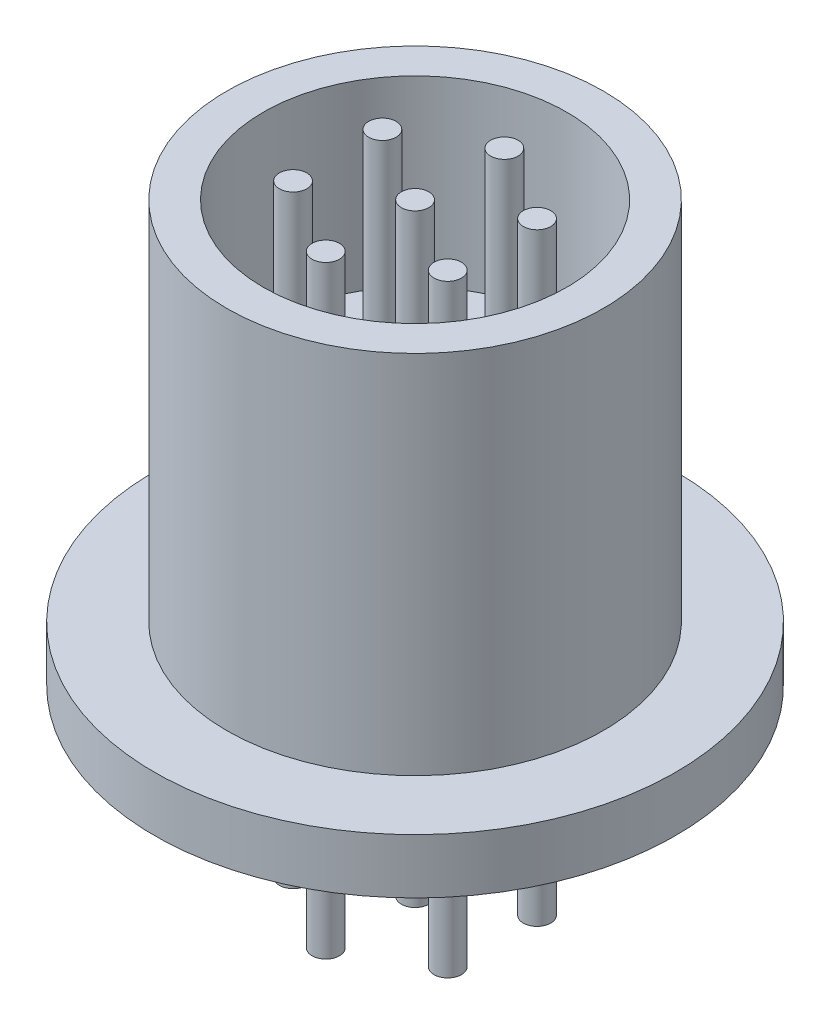
ISO-10303-21;
HEADER;
FILE_DESCRIPTION(('STEP AP214'),'2;1');
FILE_NAME('part.step','',(''),(''),'','','');
FILE_SCHEMA(('AUTOMOTIVE_DESIGN { 1 0 10303 214 1 1 1 1 }'));
ENDSEC;
DATA;
#1=APPLICATION_CONTEXT('core data for automotive mechanical design processes');
#2=APPLICATION_PROTOCOL_DEFINITION('international standard','automotive_design',2000,#1);
#3=PRODUCT_CONTEXT('',#1,'mechanical');
#4=PRODUCT('Part','Part','',(#3));
#5=PRODUCT_RELATED_PRODUCT_CATEGORY('part','',(#4));
#6=PRODUCT_DEFINITION_FORMATION('','',#4);
#7=PRODUCT_DEFINITION_CONTEXT('part definition',#1,'design');
#8=PRODUCT_DEFINITION('design','',#6,#7);
#9=PRODUCT_DEFINITION_SHAPE('','',#8);
#10=(LENGTH_UNIT() NAMED_UNIT(*) SI_UNIT(.MILLI.,.METRE.));
#11=(NAMED_UNIT(*) PLANE_ANGLE_UNIT() SI_UNIT($,.RADIAN.));
#12=(NAMED_UNIT(*) SI_UNIT($,.STERADIAN.) SOLID_ANGLE_UNIT());
#13=UNCERTAINTY_MEASURE_WITH_UNIT(LENGTH_MEASURE(1.E-05),#10,'distance_accuracy_value','');
#14=(GEOMETRIC_REPRESENTATION_CONTEXT(3) GLOBAL_UNCERTAINTY_ASSIGNED_CONTEXT((#13)) GLOBAL_UNIT_ASSIGNED_CONTEXT((#10,
#11,#12)) REPRESENTATION_CONTEXT('',''));
#15=CARTESIAN_POINT('',(0.,0.,0.));
#16=DIRECTION('',(0.,0.,1.));
#17=DIRECTION('',(1.,0.,0.));
#18=AXIS2_PLACEMENT_3D('',#15,#16,#17);
#19=CARTESIAN_POINT('',(0.,20.,0.));
#20=DIRECTION('',(0.,-1.,0.));
#21=DIRECTION('',(0.,0.,-1.));
#22=AXIS2_PLACEMENT_3D('',#19,#20,#21);
#23=CYLINDRICAL_SURFACE('',#22,10.3);
#24=CARTESIAN_POINT('',(0.,20.,0.));
#25=DIRECTION('',(0.,1.,0.));
#26=DIRECTION('',(0.,0.,1.));
#27=AXIS2_PLACEMENT_3D('',#24,#25,#26);
#28=CIRCLE('',#27,10.3);
#29=CARTESIAN_POINT('',(0.,20.,10.3));
#30=VERTEX_POINT('',#29);
#31=EDGE_CURVE('E10',#30,#30,#28,.T.);
#32=ORIENTED_EDGE('',*,*,#31,.F.);
#33=EDGE_LOOP('',(#32));
#34=FACE_BOUND('',#33,.T.);
#35=CARTESIAN_POINT('',(0.,0.,0.));
#36=DIRECTION('',(0.,-1.,0.));
#37=DIRECTION('',(0.,0.,-1.));
#38=AXIS2_PLACEMENT_3D('',#35,#36,#37);
#39=CIRCLE('',#38,10.3);
#40=CARTESIAN_POINT('',(0.,0.,-10.3));
#41=VERTEX_POINT('',#40);
#42=EDGE_CURVE('E39',#41,#41,#39,.T.);
#43=ORIENTED_EDGE('',*,*,#42,.F.);
#44=EDGE_LOOP('',(#43));
#45=FACE_BOUND('',#44,.T.);
#46=ADVANCED_FACE('F33',(#34,#45),#23,.T.);
#47=CARTESIAN_POINT('',(0.,20.,0.));
#48=DIRECTION('',(0.,1.,0.));
#49=DIRECTION('',(0.,0.,1.));
#50=AXIS2_PLACEMENT_3D('',#47,#48,#49);
#51=PLANE('',#50);
#52=CARTESIAN_POINT('',(0.,20.,0.));
#53=DIRECTION('',(0.,1.,0.));
#54=DIRECTION('',(0.,0.,1.));
#55=AXIS2_PLACEMENT_3D('',#52,#53,#54);
#56=CIRCLE('',#55,8.3);
#57=CARTESIAN_POINT('',(0.,20.,8.3));
#58=VERTEX_POINT('',#57);
#59=EDGE_CURVE('E53',#58,#58,#56,.T.);
#60=ORIENTED_EDGE('',*,*,#59,.F.);
#61=EDGE_LOOP('',(#60));
#62=FACE_BOUND('',#61,.T.);
#63=ORIENTED_EDGE('',*,*,#31,.T.);
#64=EDGE_LOOP('',(#63));
#65=FACE_BOUND('',#64,.T.);
#66=ADVANCED_FACE('F174',(#62,#65),#51,.T.);
#67=CARTESIAN_POINT('',(0.,-3.,0.));
#68=DIRECTION('',(0.,1.,0.));
#69=DIRECTION('',(0.,0.,1.));
#70=AXIS2_PLACEMENT_3D('',#67,#68,#69);
#71=CYLINDRICAL_SURFACE('',#70,14.25);
#72=CARTESIAN_POINT('',(0.,-3.,0.));
#73=DIRECTION('',(0.,-1.,0.));
#74=DIRECTION('',(0.,0.,-1.));
#75=AXIS2_PLACEMENT_3D('',#72,#73,#74);
#76=CIRCLE('',#75,14.25);
#77=CARTESIAN_POINT('',(0.,-3.,-14.25));
#78=VERTEX_POINT('',#77);
#79=EDGE_CURVE('E43',#78,#78,#76,.T.);
#80=ORIENTED_EDGE('',*,*,#79,.F.);
#81=EDGE_LOOP('',(#80));
#82=FACE_BOUND('',#81,.T.);
#83=CARTESIAN_POINT('',(0.,0.,0.));
#84=DIRECTION('',(0.,-1.,0.));
#85=DIRECTION('',(0.,0.,-1.));
#86=AXIS2_PLACEMENT_3D('',#83,#84,#85);
#87=CIRCLE('',#86,14.25);
#88=CARTESIAN_POINT('',(0.,0.,-14.25));
#89=VERTEX_POINT('',#88);
#90=EDGE_CURVE('E47',#89,#89,#87,.T.);
#91=ORIENTED_EDGE('',*,*,#90,.T.);
#92=EDGE_LOOP('',(#91));
#93=FACE_BOUND('',#92,.T.);
#94=ADVANCED_FACE('F156',(#82,#93),#71,.T.);
#95=CARTESIAN_POINT('',(0.,-3.,0.));
#96=DIRECTION('',(0.,-1.,0.));
#97=DIRECTION('',(0.,0.,-1.));
#98=AXIS2_PLACEMENT_3D('',#95,#96,#97);
#99=PLANE('',#98);
#100=CARTESIAN_POINT('',(0.,-3.,-4.88438553198296));
#101=DIRECTION('',(0.,-1.,0.));
#102=DIRECTION('',(0.,0.,-1.));
#103=AXIS2_PLACEMENT_3D('',#100,#101,#102);
#104=CIRCLE('',#103,0.75);
#105=CARTESIAN_POINT('',(0.,-3.,-5.63438553198296));
#106=VERTEX_POINT('',#105);
#107=EDGE_CURVE('E137',#106,#106,#104,.T.);
#108=ORIENTED_EDGE('',*,*,#107,.F.);
#109=EDGE_LOOP('',(#108));
#110=FACE_BOUND('',#109,.T.);
#111=CARTESIAN_POINT('',(4.23000195257455,-3.,-2.44219276599172));
#112=DIRECTION('',(0.,-1.,0.));
#113=DIRECTION('',(0.,0.,-1.));
#114=AXIS2_PLACEMENT_3D('',#111,#112,#113);
#115=CIRCLE('',#114,0.75);
#116=CARTESIAN_POINT('',(4.23000195257455,-3.,-3.19219276599172));
#117=VERTEX_POINT('',#116);
#118=EDGE_CURVE('E131',#117,#117,#115,.T.);
#119=ORIENTED_EDGE('',*,*,#118,.F.);
#120=EDGE_LOOP('',(#119));
#121=FACE_BOUND('',#120,.T.);
#122=CARTESIAN_POINT('',(4.23000195257483,-3.,2.44219276599124));
#123=DIRECTION('',(0.,-1.,0.));
#124=DIRECTION('',(0.,0.,-1.));
#125=AXIS2_PLACEMENT_3D('',#122,#123,#124);
#126=CIRCLE('',#125,0.749999999999999);
#127=CARTESIAN_POINT('',(4.23000195257483,-3.,1.69219276599124));
#128=VERTEX_POINT('',#127);
#129=EDGE_CURVE('E125',#128,#128,#126,.T.);
#130=ORIENTED_EDGE('',*,*,#129,.F.);
#131=EDGE_LOOP('',(#130));
#132=FACE_BOUND('',#131,.T.);
#133=CARTESIAN_POINT('',(5.54094015922848E-13,-3.,4.88438553198296));
#134=DIRECTION('',(0.,-1.,0.));
#135=DIRECTION('',(0.,0.,-1.));
#136=AXIS2_PLACEMENT_3D('',#133,#134,#135);
#137=CIRCLE('',#136,0.75);
#138=CARTESIAN_POINT('',(5.54094015922848E-13,-3.,4.13438553198296));
#139=VERTEX_POINT('',#138);
#140=EDGE_CURVE('E119',#139,#139,#137,.T.);
#141=ORIENTED_EDGE('',*,*,#140,.F.);
#142=EDGE_LOOP('',(#141));
#143=FACE_BOUND('',#142,.T.);
#144=CARTESIAN_POINT('',(-4.230001952574,-3.,2.44219276599172));
#145=DIRECTION('',(0.,-1.,0.));
#146=DIRECTION('',(0.,0.,-1.));
#147=AXIS2_PLACEMENT_3D('',#144,#145,#146);
#148=CIRCLE('',#147,0.75);
#149=CARTESIAN_POINT('',(-4.230001952574,-3.,1.69219276599172));
#150=VERTEX_POINT('',#149);
#151=EDGE_CURVE('E113',#150,#150,#148,.T.);
#152=ORIENTED_EDGE('',*,*,#151,.F.);
#153=EDGE_LOOP('',(#152));
#154=FACE_BOUND('',#153,.T.);
#155=CARTESIAN_POINT('',(-4.23000195257428,-3.,-2.44219276599124));
#156=DIRECTION('',(0.,-1.,0.));
#157=DIRECTION('',(0.,0.,-1.));
#158=AXIS2_PLACEMENT_3D('',#155,#156,#157);
#159=CIRCLE('',#158,0.75);
#160=CARTESIAN_POINT('',(-4.23000195257428,-3.,-3.19219276599124));
#161=VERTEX_POINT('',#160);
#162=EDGE_CURVE('E107',#161,#161,#159,.T.);
#163=ORIENTED_EDGE('',*,*,#162,.F.);
#164=EDGE_LOOP('',(#163));
#165=FACE_BOUND('',#164,.T.);
#166=CARTESIAN_POINT('',(0.,-3.,0.));
#167=DIRECTION('',(0.,-1.,0.));
#168=DIRECTION('',(0.,0.,-1.));
#169=AXIS2_PLACEMENT_3D('',#166,#167,#168);
#170=CIRCLE('',#169,0.75);
#171=CARTESIAN_POINT('',(0.,-3.,-0.75));
#172=VERTEX_POINT('',#171);
#173=EDGE_CURVE('E101',#172,#172,#170,.T.);
#174=ORIENTED_EDGE('',*,*,#173,.F.);
#175=EDGE_LOOP('',(#174));
#176=FACE_BOUND('',#175,.T.);
#177=ORIENTED_EDGE('',*,*,#79,.T.);
#178=EDGE_LOOP('',(#177));
#179=FACE_BOUND('',#178,.T.);
#180=ADVANCED_FACE('F152',(#110,#121,#132,#143,#154,#165,#176,#179),#99,.T.);
#181=CARTESIAN_POINT('',(0.,0.,0.));
#182=DIRECTION('',(0.,-1.,0.));
#183=DIRECTION('',(0.,0.,-1.));
#184=AXIS2_PLACEMENT_3D('',#181,#182,#183);
#185=PLANE('',#184);
#186=ORIENTED_EDGE('',*,*,#42,.T.);
#187=EDGE_LOOP('',(#186));
#188=FACE_BOUND('',#187,.T.);
#189=ORIENTED_EDGE('',*,*,#90,.F.);
#190=EDGE_LOOP('',(#189));
#191=FACE_BOUND('',#190,.T.);
#192=ADVANCED_FACE('F155',(#188,#191),#185,.F.);
#193=CARTESIAN_POINT('',(0.,10.,0.));
#194=DIRECTION('',(0.,1.,0.));
#195=DIRECTION('',(0.,0.,1.));
#196=AXIS2_PLACEMENT_3D('',#193,#194,#195);
#197=CYLINDRICAL_SURFACE('',#196,8.3);
#198=CARTESIAN_POINT('',(0.,10.,0.));
#199=DIRECTION('',(0.,1.,0.));
#200=DIRECTION('',(0.,0.,1.));
#201=AXIS2_PLACEMENT_3D('',#198,#199,#200);
#202=CIRCLE('',#201,8.3);
#203=CARTESIAN_POINT('',(0.,10.,8.3));
#204=VERTEX_POINT('',#203);
#205=EDGE_CURVE('E51',#204,#204,#202,.T.);
#206=ORIENTED_EDGE('',*,*,#205,.F.);
#207=EDGE_LOOP('',(#206));
#208=FACE_BOUND('',#207,.T.);
#209=ORIENTED_EDGE('',*,*,#59,.T.);
#210=EDGE_LOOP('',(#209));
#211=FACE_BOUND('',#210,.T.);
#212=ADVANCED_FACE('F179',(#208,#211),#197,.F.);
#213=CARTESIAN_POINT('',(0.,10.,0.));
#214=DIRECTION('',(0.,1.,0.));
#215=DIRECTION('',(0.,0.,1.));
#216=AXIS2_PLACEMENT_3D('',#213,#214,#215);
#217=PLANE('',#216);
#218=CARTESIAN_POINT('',(-4.23000195257428,10.,-2.44219276599124));
#219=DIRECTION('',(0.,1.,0.));
#220=DIRECTION('',(0.,0.,1.));
#221=AXIS2_PLACEMENT_3D('',#218,#219,#220);
#222=CIRCLE('',#221,0.75);
#223=CARTESIAN_POINT('',(-4.23000195257428,10.,-1.69219276599124));
#224=VERTEX_POINT('',#223);
#225=EDGE_CURVE('E95',#224,#224,#222,.T.);
#226=ORIENTED_EDGE('',*,*,#225,.F.);
#227=EDGE_LOOP('',(#226));
#228=FACE_BOUND('',#227,.T.);
#229=CARTESIAN_POINT('',(-4.230001952574,10.,2.44219276599172));
#230=DIRECTION('',(0.,1.,0.));
#231=DIRECTION('',(0.,0.,1.));
#232=AXIS2_PLACEMENT_3D('',#229,#230,#231);
#233=CIRCLE('',#232,0.75);
#234=CARTESIAN_POINT('',(-4.230001952574,10.,3.19219276599172));
#235=VERTEX_POINT('',#234);
#236=EDGE_CURVE('E89',#235,#235,#233,.T.);
#237=ORIENTED_EDGE('',*,*,#236,.F.);
#238=EDGE_LOOP('',(#237));
#239=FACE_BOUND('',#238,.T.);
#240=CARTESIAN_POINT('',(5.54094015922848E-13,10.,4.88438553198296));
#241=DIRECTION('',(0.,1.,0.));
#242=DIRECTION('',(0.,0.,1.));
#243=AXIS2_PLACEMENT_3D('',#240,#241,#242);
#244=CIRCLE('',#243,0.75);
#245=CARTESIAN_POINT('',(5.54094015922848E-13,10.,5.63438553198296));
#246=VERTEX_POINT('',#245);
#247=EDGE_CURVE('E83',#246,#246,#244,.T.);
#248=ORIENTED_EDGE('',*,*,#247,.F.);
#249=EDGE_LOOP('',(#248));
#250=FACE_BOUND('',#249,.T.);
#251=CARTESIAN_POINT('',(4.23000195257483,10.,2.44219276599124));
#252=DIRECTION('',(0.,1.,0.));
#253=DIRECTION('',(0.,0.,1.));
#254=AXIS2_PLACEMENT_3D('',#251,#252,#253);
#255=CIRCLE('',#254,0.749999999999999);
#256=CARTESIAN_POINT('',(4.23000195257483,10.,3.19219276599124));
#257=VERTEX_POINT('',#256);
#258=EDGE_CURVE('E77',#257,#257,#255,.T.);
#259=ORIENTED_EDGE('',*,*,#258,.F.);
#260=EDGE_LOOP('',(#259));
#261=FACE_BOUND('',#260,.T.);
#262=CARTESIAN_POINT('',(4.23000195257455,10.,-2.44219276599172));
#263=DIRECTION('',(0.,1.,0.));
#264=DIRECTION('',(0.,0.,1.));
#265=AXIS2_PLACEMENT_3D('',#262,#263,#264);
#266=CIRCLE('',#265,0.75);
#267=CARTESIAN_POINT('',(4.23000195257455,10.,-1.69219276599172));
#268=VERTEX_POINT('',#267);
#269=EDGE_CURVE('E71',#268,#268,#266,.T.);
#270=ORIENTED_EDGE('',*,*,#269,.F.);
#271=EDGE_LOOP('',(#270));
#272=FACE_BOUND('',#271,.T.);
#273=CARTESIAN_POINT('',(0.,10.,0.));
#274=DIRECTION('',(0.,1.,0.));
#275=DIRECTION('',(0.,0.,1.));
#276=AXIS2_PLACEMENT_3D('',#273,#274,#275);
#277=CIRCLE('',#276,0.75);
#278=CARTESIAN_POINT('',(0.,10.,0.75));
#279=VERTEX_POINT('',#278);
#280=EDGE_CURVE('E65',#279,#279,#277,.T.);
#281=ORIENTED_EDGE('',*,*,#280,.F.);
#282=EDGE_LOOP('',(#281));
#283=FACE_BOUND('',#282,.T.);
#284=CARTESIAN_POINT('',(0.,10.,-4.88438553198296));
#285=DIRECTION('',(0.,1.,0.));
#286=DIRECTION('',(0.,0.,1.));
#287=AXIS2_PLACEMENT_3D('',#284,#285,#286);
#288=CIRCLE('',#287,0.75);
#289=CARTESIAN_POINT('',(0.,10.,-4.13438553198296));
#290=VERTEX_POINT('',#289);
#291=EDGE_CURVE('E59',#290,#290,#288,.T.);
#292=ORIENTED_EDGE('',*,*,#291,.F.);
#293=EDGE_LOOP('',(#292));
#294=FACE_BOUND('',#293,.T.);
#295=ORIENTED_EDGE('',*,*,#205,.T.);
#296=EDGE_LOOP('',(#295));
#297=FACE_BOUND('',#296,.T.);
#298=ADVANCED_FACE('F184',(#228,#239,#250,#261,#272,#283,#294,#297),#217,.T.);
#299=CARTESIAN_POINT('',(0.,20.,-4.88438553198296));
#300=DIRECTION('',(0.,-1.,0.));
#301=DIRECTION('',(0.,0.,-1.));
#302=AXIS2_PLACEMENT_3D('',#299,#300,#301);
#303=CYLINDRICAL_SURFACE('',#302,0.75);
#304=CARTESIAN_POINT('',(0.,20.,-4.88438553198296));
#305=DIRECTION('',(0.,1.,0.));
#306=DIRECTION('',(0.,0.,1.));
#307=AXIS2_PLACEMENT_3D('',#304,#305,#306);
#308=CIRCLE('',#307,0.75);
#309=CARTESIAN_POINT('',(0.,20.,-4.13438553198296));
#310=VERTEX_POINT('',#309);
#311=EDGE_CURVE('E56',#310,#310,#308,.T.);
#312=ORIENTED_EDGE('',*,*,#311,.F.);
#313=EDGE_LOOP('',(#312));
#314=FACE_BOUND('',#313,.T.);
#315=ORIENTED_EDGE('',*,*,#291,.T.);
#316=EDGE_LOOP('',(#315));
#317=FACE_BOUND('',#316,.T.);
#318=ADVANCED_FACE('F401',(#314,#317),#303,.T.);
#319=CARTESIAN_POINT('',(0.,20.,-4.88438553198296));
#320=DIRECTION('',(0.,1.,0.));
#321=DIRECTION('',(0.,0.,1.));
#322=AXIS2_PLACEMENT_3D('',#319,#320,#321);
#323=PLANE('',#322);
#324=ORIENTED_EDGE('',*,*,#311,.T.);
#325=EDGE_LOOP('',(#324));
#326=FACE_BOUND('',#325,.T.);
#327=ADVANCED_FACE('F397',(#326),#323,.T.);
#328=CARTESIAN_POINT('',(0.,20.,0.));
#329=DIRECTION('',(0.,-1.,0.));
#330=DIRECTION('',(0.,0.,-1.));
#331=AXIS2_PLACEMENT_3D('',#328,#329,#330);
#332=CYLINDRICAL_SURFACE('',#331,0.75);
#333=CARTESIAN_POINT('',(0.,20.,0.));
#334=DIRECTION('',(0.,1.,0.));
#335=DIRECTION('',(0.,0.,1.));
#336=AXIS2_PLACEMENT_3D('',#333,#334,#335);
#337=CIRCLE('',#336,0.75);
#338=CARTESIAN_POINT('',(0.,20.,0.75));
#339=VERTEX_POINT('',#338);
#340=EDGE_CURVE('E62',#339,#339,#337,.T.);
#341=ORIENTED_EDGE('',*,*,#340,.F.);
#342=EDGE_LOOP('',(#341));
#343=FACE_BOUND('',#342,.T.);
#344=ORIENTED_EDGE('',*,*,#280,.T.);
#345=EDGE_LOOP('',(#344));
#346=FACE_BOUND('',#345,.T.);
#347=ADVANCED_FACE('F393',(#343,#346),#332,.T.);
#348=CARTESIAN_POINT('',(0.,20.,0.));
#349=DIRECTION('',(0.,1.,0.));
#350=DIRECTION('',(0.,0.,1.));
#351=AXIS2_PLACEMENT_3D('',#348,#349,#350);
#352=PLANE('',#351);
#353=ORIENTED_EDGE('',*,*,#340,.T.);
#354=EDGE_LOOP('',(#353));
#355=FACE_BOUND('',#354,.T.);
#356=ADVANCED_FACE('F389',(#355),#352,.T.);
#357=CARTESIAN_POINT('',(4.23000195257455,20.,-2.44219276599172));
#358=DIRECTION('',(0.,-1.,0.));
#359=DIRECTION('',(0.,0.,-1.));
#360=AXIS2_PLACEMENT_3D('',#357,#358,#359);
#361=CYLINDRICAL_SURFACE('',#360,0.75);
#362=CARTESIAN_POINT('',(4.23000195257455,20.,-2.44219276599172));
#363=DIRECTION('',(0.,1.,0.));
#364=DIRECTION('',(0.,0.,1.));
#365=AXIS2_PLACEMENT_3D('',#362,#363,#364);
#366=CIRCLE('',#365,0.75);
#367=CARTESIAN_POINT('',(4.23000195257455,20.,-1.69219276599172));
#368=VERTEX_POINT('',#367);
#369=EDGE_CURVE('E68',#368,#368,#366,.T.);
#370=ORIENTED_EDGE('',*,*,#369,.F.);
#371=EDGE_LOOP('',(#370));
#372=FACE_BOUND('',#371,.T.);
#373=ORIENTED_EDGE('',*,*,#269,.T.);
#374=EDGE_LOOP('',(#373));
#375=FACE_BOUND('',#374,.T.);
#376=ADVANCED_FACE('F385',(#372,#375),#361,.T.);
#377=CARTESIAN_POINT('',(4.23000195257455,20.,-2.44219276599172));
#378=DIRECTION('',(0.,1.,0.));
#379=DIRECTION('',(0.,0.,1.));
#380=AXIS2_PLACEMENT_3D('',#377,#378,#379);
#381=PLANE('',#380);
#382=ORIENTED_EDGE('',*,*,#369,.T.);
#383=EDGE_LOOP('',(#382));
#384=FACE_BOUND('',#383,.T.);
#385=ADVANCED_FACE('F381',(#384),#381,.T.);
#386=CARTESIAN_POINT('',(4.23000195257483,20.,2.44219276599124));
#387=DIRECTION('',(0.,-1.,0.));
#388=DIRECTION('',(0.,0.,-1.));
#389=AXIS2_PLACEMENT_3D('',#386,#387,#388);
#390=CYLINDRICAL_SURFACE('',#389,0.749999999999999);
#391=CARTESIAN_POINT('',(4.23000195257483,20.,2.44219276599124));
#392=DIRECTION('',(0.,1.,0.));
#393=DIRECTION('',(0.,0.,1.));
#394=AXIS2_PLACEMENT_3D('',#391,#392,#393);
#395=CIRCLE('',#394,0.749999999999999);
#396=CARTESIAN_POINT('',(4.23000195257483,20.,3.19219276599124));
#397=VERTEX_POINT('',#396);
#398=EDGE_CURVE('E74',#397,#397,#395,.T.);
#399=ORIENTED_EDGE('',*,*,#398,.F.);
#400=EDGE_LOOP('',(#399));
#401=FACE_BOUND('',#400,.T.);
#402=ORIENTED_EDGE('',*,*,#258,.T.);
#403=EDGE_LOOP('',(#402));
#404=FACE_BOUND('',#403,.T.);
#405=ADVANCED_FACE('F377',(#401,#404),#390,.T.);
#406=CARTESIAN_POINT('',(4.23000195257483,20.,2.44219276599124));
#407=DIRECTION('',(0.,1.,0.));
#408=DIRECTION('',(0.,0.,1.));
#409=AXIS2_PLACEMENT_3D('',#406,#407,#408);
#410=PLANE('',#409);
#411=ORIENTED_EDGE('',*,*,#398,.T.);
#412=EDGE_LOOP('',(#411));
#413=FACE_BOUND('',#412,.T.);
#414=ADVANCED_FACE('F373',(#413),#410,.T.);
#415=CARTESIAN_POINT('',(5.54094015922848E-13,20.,4.88438553198296));
#416=DIRECTION('',(0.,-1.,0.));
#417=DIRECTION('',(0.,0.,-1.));
#418=AXIS2_PLACEMENT_3D('',#415,#416,#417);
#419=CYLINDRICAL_SURFACE('',#418,0.75);
#420=CARTESIAN_POINT('',(5.54094015922848E-13,20.,4.88438553198296));
#421=DIRECTION('',(0.,1.,0.));
#422=DIRECTION('',(0.,0.,1.));
#423=AXIS2_PLACEMENT_3D('',#420,#421,#422);
#424=CIRCLE('',#423,0.75);
#425=CARTESIAN_POINT('',(5.54094015922848E-13,20.,5.63438553198296));
#426=VERTEX_POINT('',#425);
#427=EDGE_CURVE('E80',#426,#426,#424,.T.);
#428=ORIENTED_EDGE('',*,*,#427,.F.);
#429=EDGE_LOOP('',(#428));
#430=FACE_BOUND('',#429,.T.);
#431=ORIENTED_EDGE('',*,*,#247,.T.);
#432=EDGE_LOOP('',(#431));
#433=FACE_BOUND('',#432,.T.);
#434=ADVANCED_FACE('F369',(#430,#433),#419,.T.);
#435=CARTESIAN_POINT('',(5.54094015922848E-13,20.,4.88438553198296));
#436=DIRECTION('',(0.,1.,0.));
#437=DIRECTION('',(0.,0.,1.));
#438=AXIS2_PLACEMENT_3D('',#435,#436,#437);
#439=PLANE('',#438);
#440=ORIENTED_EDGE('',*,*,#427,.T.);
#441=EDGE_LOOP('',(#440));
#442=FACE_BOUND('',#441,.T.);
#443=ADVANCED_FACE('F365',(#442),#439,.T.);
#444=CARTESIAN_POINT('',(-4.230001952574,20.,2.44219276599172));
#445=DIRECTION('',(0.,-1.,0.));
#446=DIRECTION('',(0.,0.,-1.));
#447=AXIS2_PLACEMENT_3D('',#444,#445,#446);
#448=CYLINDRICAL_SURFACE('',#447,0.75);
#449=CARTESIAN_POINT('',(-4.230001952574,20.,2.44219276599172));
#450=DIRECTION('',(0.,1.,0.));
#451=DIRECTION('',(0.,0.,1.));
#452=AXIS2_PLACEMENT_3D('',#449,#450,#451);
#453=CIRCLE('',#452,0.75);
#454=CARTESIAN_POINT('',(-4.230001952574,20.,3.19219276599172));
#455=VERTEX_POINT('',#454);
#456=EDGE_CURVE('E86',#455,#455,#453,.T.);
#457=ORIENTED_EDGE('',*,*,#456,.F.);
#458=EDGE_LOOP('',(#457));
#459=FACE_BOUND('',#458,.T.);
#460=ORIENTED_EDGE('',*,*,#236,.T.);
#461=EDGE_LOOP('',(#460));
#462=FACE_BOUND('',#461,.T.);
#463=ADVANCED_FACE('F361',(#459,#462),#448,.T.);
#464=CARTESIAN_POINT('',(-4.230001952574,20.,2.44219276599172));
#465=DIRECTION('',(0.,1.,0.));
#466=DIRECTION('',(0.,0.,1.));
#467=AXIS2_PLACEMENT_3D('',#464,#465,#466);
#468=PLANE('',#467);
#469=ORIENTED_EDGE('',*,*,#456,.T.);
#470=EDGE_LOOP('',(#469));
#471=FACE_BOUND('',#470,.T.);
#472=ADVANCED_FACE('F357',(#471),#468,.T.);
#473=CARTESIAN_POINT('',(-4.23000195257428,20.,-2.44219276599124));
#474=DIRECTION('',(0.,-1.,0.));
#475=DIRECTION('',(0.,0.,-1.));
#476=AXIS2_PLACEMENT_3D('',#473,#474,#475);
#477=CYLINDRICAL_SURFACE('',#476,0.75);
#478=CARTESIAN_POINT('',(-4.23000195257428,20.,-2.44219276599124));
#479=DIRECTION('',(0.,1.,0.));
#480=DIRECTION('',(0.,0.,1.));
#481=AXIS2_PLACEMENT_3D('',#478,#479,#480);
#482=CIRCLE('',#481,0.75);
#483=CARTESIAN_POINT('',(-4.23000195257428,20.,-1.69219276599124));
#484=VERTEX_POINT('',#483);
#485=EDGE_CURVE('E92',#484,#484,#482,.T.);
#486=ORIENTED_EDGE('',*,*,#485,.F.);
#487=EDGE_LOOP('',(#486));
#488=FACE_BOUND('',#487,.T.);
#489=ORIENTED_EDGE('',*,*,#225,.T.);
#490=EDGE_LOOP('',(#489));
#491=FACE_BOUND('',#490,.T.);
#492=ADVANCED_FACE('F353',(#488,#491),#477,.T.);
#493=CARTESIAN_POINT('',(-4.23000195257428,20.,-2.44219276599124));
#494=DIRECTION('',(0.,1.,0.));
#495=DIRECTION('',(0.,0.,1.));
#496=AXIS2_PLACEMENT_3D('',#493,#494,#495);
#497=PLANE('',#496);
#498=ORIENTED_EDGE('',*,*,#485,.T.);
#499=EDGE_LOOP('',(#498));
#500=FACE_BOUND('',#499,.T.);
#501=ADVANCED_FACE('F214',(#500),#497,.T.);
#502=CARTESIAN_POINT('',(0.,-13.,0.));
#503=DIRECTION('',(0.,1.,0.));
#504=DIRECTION('',(0.,0.,1.));
#505=AXIS2_PLACEMENT_3D('',#502,#503,#504);
#506=CYLINDRICAL_SURFACE('',#505,0.75);
#507=CARTESIAN_POINT('',(0.,-13.,0.));
#508=DIRECTION('',(0.,-1.,0.));
#509=DIRECTION('',(0.,0.,-1.));
#510=AXIS2_PLACEMENT_3D('',#507,#508,#509);
#511=CIRCLE('',#510,0.75);
#512=CARTESIAN_POINT('',(0.,-13.,-0.75));
#513=VERTEX_POINT('',#512);
#514=EDGE_CURVE('E98',#513,#513,#511,.T.);
#515=ORIENTED_EDGE('',*,*,#514,.F.);
#516=EDGE_LOOP('',(#515));
#517=FACE_BOUND('',#516,.T.);
#518=ORIENTED_EDGE('',*,*,#173,.T.);
#519=EDGE_LOOP('',(#518));
#520=FACE_BOUND('',#519,.T.);
#521=ADVANCED_FACE('F219',(#517,#520),#506,.T.);
#522=CARTESIAN_POINT('',(0.,-13.,0.));
#523=DIRECTION('',(0.,-1.,0.));
#524=DIRECTION('',(0.,0.,-1.));
#525=AXIS2_PLACEMENT_3D('',#522,#523,#524);
#526=PLANE('',#525);
#527=ORIENTED_EDGE('',*,*,#514,.T.);
#528=EDGE_LOOP('',(#527));
#529=FACE_BOUND('',#528,.T.);
#530=ADVANCED_FACE('F224',(#529),#526,.T.);
#531=CARTESIAN_POINT('',(-4.23000195257428,-13.,-2.44219276599124));
#532=DIRECTION('',(0.,1.,0.));
#533=DIRECTION('',(0.,0.,1.));
#534=AXIS2_PLACEMENT_3D('',#531,#532,#533);
#535=CYLINDRICAL_SURFACE('',#534,0.75);
#536=CARTESIAN_POINT('',(-4.23000195257428,-13.,-2.44219276599124));
#537=DIRECTION('',(0.,-1.,0.));
#538=DIRECTION('',(0.,0.,-1.));
#539=AXIS2_PLACEMENT_3D('',#536,#537,#538);
#540=CIRCLE('',#539,0.75);
#541=CARTESIAN_POINT('',(-4.23000195257428,-13.,-3.19219276599124));
#542=VERTEX_POINT('',#541);
#543=EDGE_CURVE('E104',#542,#542,#540,.T.);
#544=ORIENTED_EDGE('',*,*,#543,.F.);
#545=EDGE_LOOP('',(#544));
#546=FACE_BOUND('',#545,.T.);
#547=ORIENTED_EDGE('',*,*,#162,.T.);
#548=EDGE_LOOP('',(#547));
#549=FACE_BOUND('',#548,.T.);
#550=ADVANCED_FACE('F234',(#546,#549),#535,.T.);
#551=CARTESIAN_POINT('',(-4.23000195257428,-13.,-2.44219276599124));
#552=DIRECTION('',(0.,-1.,0.));
#553=DIRECTION('',(0.,0.,-1.));
#554=AXIS2_PLACEMENT_3D('',#551,#552,#553);
#555=PLANE('',#554);
#556=ORIENTED_EDGE('',*,*,#543,.T.);
#557=EDGE_LOOP('',(#556));
#558=FACE_BOUND('',#557,.T.);
#559=ADVANCED_FACE('F244',(#558),#555,.T.);
#560=CARTESIAN_POINT('',(-4.230001952574,-13.,2.44219276599172));
#561=DIRECTION('',(0.,1.,0.));
#562=DIRECTION('',(0.,0.,1.));
#563=AXIS2_PLACEMENT_3D('',#560,#561,#562);
#564=CYLINDRICAL_SURFACE('',#563,0.75);
#565=CARTESIAN_POINT('',(-4.230001952574,-13.,2.44219276599172));
#566=DIRECTION('',(0.,-1.,0.));
#567=DIRECTION('',(0.,0.,-1.));
#568=AXIS2_PLACEMENT_3D('',#565,#566,#567);
#569=CIRCLE('',#568,0.75);
#570=CARTESIAN_POINT('',(-4.230001952574,-13.,1.69219276599172));
#571=VERTEX_POINT('',#570);
#572=EDGE_CURVE('E110',#571,#571,#569,.T.);
#573=ORIENTED_EDGE('',*,*,#572,.F.);
#574=EDGE_LOOP('',(#573));
#575=FACE_BOUND('',#574,.T.);
#576=ORIENTED_EDGE('',*,*,#151,.T.);
#577=EDGE_LOOP('',(#576));
#578=FACE_BOUND('',#577,.T.);
#579=ADVANCED_FACE('F254',(#575,#578),#564,.T.);
#580=CARTESIAN_POINT('',(-4.230001952574,-13.,2.44219276599172));
#581=DIRECTION('',(0.,-1.,0.));
#582=DIRECTION('',(0.,0.,-1.));
#583=AXIS2_PLACEMENT_3D('',#580,#581,#582);
#584=PLANE('',#583);
#585=ORIENTED_EDGE('',*,*,#572,.T.);
#586=EDGE_LOOP('',(#585));
#587=FACE_BOUND('',#586,.T.);
#588=ADVANCED_FACE('F264',(#587),#584,.T.);
#589=CARTESIAN_POINT('',(5.54094015922848E-13,-13.,4.88438553198296));
#590=DIRECTION('',(0.,1.,0.));
#591=DIRECTION('',(0.,0.,1.));
#592=AXIS2_PLACEMENT_3D('',#589,#590,#591);
#593=CYLINDRICAL_SURFACE('',#592,0.75);
#594=CARTESIAN_POINT('',(5.54094015922848E-13,-13.,4.88438553198296));
#595=DIRECTION('',(0.,-1.,0.));
#596=DIRECTION('',(0.,0.,-1.));
#597=AXIS2_PLACEMENT_3D('',#594,#595,#596);
#598=CIRCLE('',#597,0.75);
#599=CARTESIAN_POINT('',(5.54094015922848E-13,-13.,4.13438553198296));
#600=VERTEX_POINT('',#599);
#601=EDGE_CURVE('E116',#600,#600,#598,.T.);
#602=ORIENTED_EDGE('',*,*,#601,.F.);
#603=EDGE_LOOP('',(#602));
#604=FACE_BOUND('',#603,.T.);
#605=ORIENTED_EDGE('',*,*,#140,.T.);
#606=EDGE_LOOP('',(#605));
#607=FACE_BOUND('',#606,.T.);
#608=ADVANCED_FACE('F274',(#604,#607),#593,.T.);
#609=CARTESIAN_POINT('',(5.54094015922848E-13,-13.,4.88438553198296));
#610=DIRECTION('',(0.,-1.,0.));
#611=DIRECTION('',(0.,0.,-1.));
#612=AXIS2_PLACEMENT_3D('',#609,#610,#611);
#613=PLANE('',#612);
#614=ORIENTED_EDGE('',*,*,#601,.T.);
#615=EDGE_LOOP('',(#614));
#616=FACE_BOUND('',#615,.T.);
#617=ADVANCED_FACE('F284',(#616),#613,.T.);
#618=CARTESIAN_POINT('',(4.23000195257483,-13.,2.44219276599124));
#619=DIRECTION('',(0.,1.,0.));
#620=DIRECTION('',(0.,0.,1.));
#621=AXIS2_PLACEMENT_3D('',#618,#619,#620);
#622=CYLINDRICAL_SURFACE('',#621,0.749999999999999);
#623=CARTESIAN_POINT('',(4.23000195257483,-13.,2.44219276599124));
#624=DIRECTION('',(0.,-1.,0.));
#625=DIRECTION('',(0.,0.,-1.));
#626=AXIS2_PLACEMENT_3D('',#623,#624,#625);
#627=CIRCLE('',#626,0.749999999999999);
#628=CARTESIAN_POINT('',(4.23000195257483,-13.,1.69219276599124));
#629=VERTEX_POINT('',#628);
#630=EDGE_CURVE('E122',#629,#629,#627,.T.);
#631=ORIENTED_EDGE('',*,*,#630,.F.);
#632=EDGE_LOOP('',(#631));
#633=FACE_BOUND('',#632,.T.);
#634=ORIENTED_EDGE('',*,*,#129,.T.);
#635=EDGE_LOOP('',(#634));
#636=FACE_BOUND('',#635,.T.);
#637=ADVANCED_FACE('F294',(#633,#636),#622,.T.);
#638=CARTESIAN_POINT('',(4.23000195257483,-13.,2.44219276599124));
#639=DIRECTION('',(0.,-1.,0.));
#640=DIRECTION('',(0.,0.,-1.));
#641=AXIS2_PLACEMENT_3D('',#638,#639,#640);
#642=PLANE('',#641);
#643=ORIENTED_EDGE('',*,*,#630,.T.);
#644=EDGE_LOOP('',(#643));
#645=FACE_BOUND('',#644,.T.);
#646=ADVANCED_FACE('F304',(#645),#642,.T.);
#647=CARTESIAN_POINT('',(4.23000195257455,-13.,-2.44219276599172));
#648=DIRECTION('',(0.,1.,0.));
#649=DIRECTION('',(0.,0.,1.));
#650=AXIS2_PLACEMENT_3D('',#647,#648,#649);
#651=CYLINDRICAL_SURFACE('',#650,0.75);
#652=CARTESIAN_POINT('',(4.23000195257455,-13.,-2.44219276599172));
#653=DIRECTION('',(0.,-1.,0.));
#654=DIRECTION('',(0.,0.,-1.));
#655=AXIS2_PLACEMENT_3D('',#652,#653,#654);
#656=CIRCLE('',#655,0.75);
#657=CARTESIAN_POINT('',(4.23000195257455,-13.,-3.19219276599172));
#658=VERTEX_POINT('',#657);
#659=EDGE_CURVE('E128',#658,#658,#656,.T.);
#660=ORIENTED_EDGE('',*,*,#659,.F.);
#661=EDGE_LOOP('',(#660));
#662=FACE_BOUND('',#661,.T.);
#663=ORIENTED_EDGE('',*,*,#118,.T.);
#664=EDGE_LOOP('',(#663));
#665=FACE_BOUND('',#664,.T.);
#666=ADVANCED_FACE('F314',(#662,#665),#651,.T.);
#667=CARTESIAN_POINT('',(4.23000195257455,-13.,-2.44219276599172));
#668=DIRECTION('',(0.,-1.,0.));
#669=DIRECTION('',(0.,0.,-1.));
#670=AXIS2_PLACEMENT_3D('',#667,#668,#669);
#671=PLANE('',#670);
#672=ORIENTED_EDGE('',*,*,#659,.T.);
#673=EDGE_LOOP('',(#672));
#674=FACE_BOUND('',#673,.T.);
#675=ADVANCED_FACE('F148',(#674),#671,.T.);
#676=CARTESIAN_POINT('',(0.,-13.,-4.88438553198296));
#677=DIRECTION('',(0.,1.,0.));
#678=DIRECTION('',(0.,0.,1.));
#679=AXIS2_PLACEMENT_3D('',#676,#677,#678);
#680=CYLINDRICAL_SURFACE('',#679,0.75);
#681=CARTESIAN_POINT('',(0.,-13.,-4.88438553198296));
#682=DIRECTION('',(0.,-1.,0.));
#683=DIRECTION('',(0.,0.,-1.));
#684=AXIS2_PLACEMENT_3D('',#681,#682,#683);
#685=CIRCLE('',#684,0.75);
#686=CARTESIAN_POINT('',(0.,-13.,-5.63438553198296));
#687=VERTEX_POINT('',#686);
#688=EDGE_CURVE('E134',#687,#687,#685,.T.);
#689=ORIENTED_EDGE('',*,*,#688,.F.);
#690=EDGE_LOOP('',(#689));
#691=FACE_BOUND('',#690,.T.);
#692=ORIENTED_EDGE('',*,*,#107,.T.);
#693=EDGE_LOOP('',(#692));
#694=FACE_BOUND('',#693,.T.);
#695=ADVANCED_FACE('F145',(#691,#694),#680,.T.);
#696=CARTESIAN_POINT('',(0.,-13.,-4.88438553198296));
#697=DIRECTION('',(0.,-1.,0.));
#698=DIRECTION('',(0.,0.,-1.));
#699=AXIS2_PLACEMENT_3D('',#696,#697,#698);
#700=PLANE('',#699);
#701=ORIENTED_EDGE('',*,*,#688,.T.);
#702=EDGE_LOOP('',(#701));
#703=FACE_BOUND('',#702,.T.);
#704=ADVANCED_FACE('F143',(#703),#700,.T.);
#705=CLOSED_SHELL('',(#46,#66,#94,#180,#192,#212,#298,#318,#327,#347,#356,#376,#385,#405,#414,
#434,#443,#463,#472,#492,#501,#521,#530,#550,#559,#579,#588,#608,#617,#637,#646,#666,#675,#695,#704));
#706=MANIFOLD_SOLID_BREP('B2',#705);
#707=ADVANCED_BREP_SHAPE_REPRESENTATION('',(#18,#706),#14);
#708=SHAPE_DEFINITION_REPRESENTATION(#9,#707);
ENDSEC;
END-ISO-10303-21;
